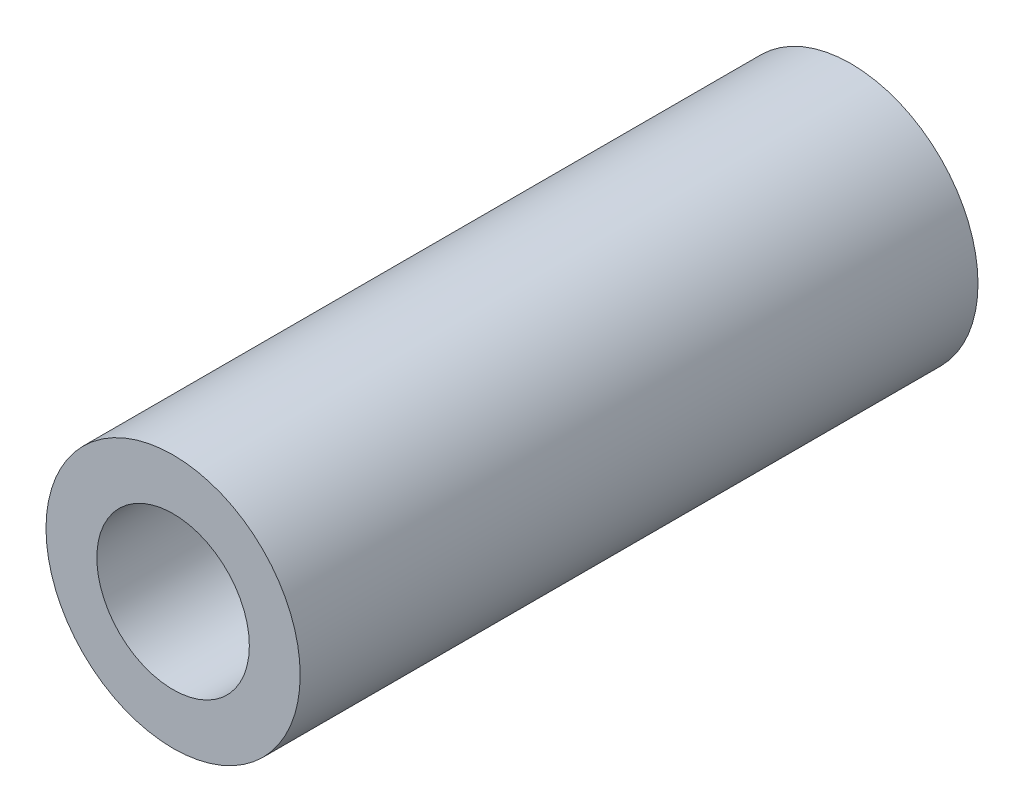
ISO-10303-21;
HEADER;
FILE_DESCRIPTION(('STEP AP214'),'2;1');
FILE_NAME('part.step','',(''),(''),'','','');
FILE_SCHEMA(('AUTOMOTIVE_DESIGN { 1 0 10303 214 1 1 1 1 }'));
ENDSEC;
DATA;
#1=APPLICATION_CONTEXT('core data for automotive mechanical design processes');
#2=APPLICATION_PROTOCOL_DEFINITION('international standard','automotive_design',2000,#1);
#3=PRODUCT_CONTEXT('',#1,'mechanical');
#4=PRODUCT('Part','Part','',(#3));
#5=PRODUCT_RELATED_PRODUCT_CATEGORY('part','',(#4));
#6=PRODUCT_DEFINITION_FORMATION('','',#4);
#7=PRODUCT_DEFINITION_CONTEXT('part definition',#1,'design');
#8=PRODUCT_DEFINITION('design','',#6,#7);
#9=PRODUCT_DEFINITION_SHAPE('','',#8);
#10=(LENGTH_UNIT() NAMED_UNIT(*) SI_UNIT(.MILLI.,.METRE.));
#11=(NAMED_UNIT(*) PLANE_ANGLE_UNIT() SI_UNIT($,.RADIAN.));
#12=(NAMED_UNIT(*) SI_UNIT($,.STERADIAN.) SOLID_ANGLE_UNIT());
#13=UNCERTAINTY_MEASURE_WITH_UNIT(LENGTH_MEASURE(1.E-05),#10,'distance_accuracy_value','');
#14=(GEOMETRIC_REPRESENTATION_CONTEXT(3) GLOBAL_UNCERTAINTY_ASSIGNED_CONTEXT((#13)) GLOBAL_UNIT_ASSIGNED_CONTEXT((#10,
#11,#12)) REPRESENTATION_CONTEXT('',''));
#15=CARTESIAN_POINT('',(0.,0.,0.));
#16=DIRECTION('',(0.,0.,1.));
#17=DIRECTION('',(1.,0.,0.));
#18=AXIS2_PLACEMENT_3D('',#15,#16,#17);
#19=CARTESIAN_POINT('',(0.,0.,20.));
#20=DIRECTION('',(0.,0.,1.));
#21=DIRECTION('',(1.,0.,0.));
#22=AXIS2_PLACEMENT_3D('',#19,#20,#21);
#23=PLANE('',#22);
#24=CARTESIAN_POINT('',(0.,0.,20.));
#25=DIRECTION('',(0.,0.,1.));
#26=DIRECTION('',(1.,0.,0.));
#27=AXIS2_PLACEMENT_3D('',#24,#25,#26);
#28=CIRCLE('',#27,7.5);
#29=CARTESIAN_POINT('',(7.5,0.,20.));
#30=VERTEX_POINT('',#29);
#31=EDGE_CURVE('E10',#30,#30,#28,.T.);
#32=ORIENTED_EDGE('',*,*,#31,.T.);
#33=EDGE_LOOP('',(#32));
#34=FACE_BOUND('',#33,.T.);
#35=CARTESIAN_POINT('',(0.,0.,20.));
#36=DIRECTION('',(0.,0.,1.));
#37=DIRECTION('',(1.,0.,0.));
#38=AXIS2_PLACEMENT_3D('',#35,#36,#37);
#39=CIRCLE('',#38,4.5);
#40=CARTESIAN_POINT('',(4.5,0.,20.));
#41=VERTEX_POINT('',#40);
#42=EDGE_CURVE('E50',#41,#41,#39,.T.);
#43=ORIENTED_EDGE('',*,*,#42,.F.);
#44=EDGE_LOOP('',(#43));
#45=FACE_BOUND('',#44,.T.);
#46=ADVANCED_FACE('F37',(#34,#45),#23,.T.);
#47=CARTESIAN_POINT('',(0.,0.,-20.));
#48=DIRECTION('',(0.,0.,1.));
#49=DIRECTION('',(1.,0.,0.));
#50=AXIS2_PLACEMENT_3D('',#47,#48,#49);
#51=PLANE('',#50);
#52=CARTESIAN_POINT('',(0.,0.,-20.));
#53=DIRECTION('',(0.,0.,1.));
#54=DIRECTION('',(1.,0.,0.));
#55=AXIS2_PLACEMENT_3D('',#52,#53,#54);
#56=CIRCLE('',#55,7.5);
#57=CARTESIAN_POINT('',(7.5,0.,-20.));
#58=VERTEX_POINT('',#57);
#59=EDGE_CURVE('E41',#58,#58,#56,.T.);
#60=ORIENTED_EDGE('',*,*,#59,.F.);
#61=EDGE_LOOP('',(#60));
#62=FACE_BOUND('',#61,.T.);
#63=CARTESIAN_POINT('',(0.,0.,-20.));
#64=DIRECTION('',(0.,0.,1.));
#65=DIRECTION('',(1.,0.,0.));
#66=AXIS2_PLACEMENT_3D('',#63,#64,#65);
#67=CIRCLE('',#66,4.5);
#68=CARTESIAN_POINT('',(4.5,0.,-20.));
#69=VERTEX_POINT('',#68);
#70=EDGE_CURVE('E52',#69,#69,#67,.T.);
#71=ORIENTED_EDGE('',*,*,#70,.T.);
#72=EDGE_LOOP('',(#71));
#73=FACE_BOUND('',#72,.T.);
#74=ADVANCED_FACE('F64',(#62,#73),#51,.F.);
#75=CARTESIAN_POINT('',(0.,0.,20.));
#76=DIRECTION('',(0.,0.,-1.));
#77=DIRECTION('',(-1.,0.,0.));
#78=AXIS2_PLACEMENT_3D('',#75,#76,#77);
#79=CYLINDRICAL_SURFACE('',#78,7.5);
#80=ORIENTED_EDGE('',*,*,#31,.F.);
#81=EDGE_LOOP('',(#80));
#82=FACE_BOUND('',#81,.T.);
#83=ORIENTED_EDGE('',*,*,#59,.T.);
#84=EDGE_LOOP('',(#83));
#85=FACE_BOUND('',#84,.T.);
#86=ADVANCED_FACE('F39',(#82,#85),#79,.T.);
#87=CARTESIAN_POINT('',(0.,0.,20.));
#88=DIRECTION('',(0.,0.,-1.));
#89=DIRECTION('',(-1.,0.,0.));
#90=AXIS2_PLACEMENT_3D('',#87,#88,#89);
#91=CYLINDRICAL_SURFACE('',#90,4.5);
#92=ORIENTED_EDGE('',*,*,#42,.T.);
#93=EDGE_LOOP('',(#92));
#94=FACE_BOUND('',#93,.T.);
#95=ORIENTED_EDGE('',*,*,#70,.F.);
#96=EDGE_LOOP('',(#95));
#97=FACE_BOUND('',#96,.T.);
#98=ADVANCED_FACE('F60',(#94,#97),#91,.F.);
#99=CLOSED_SHELL('',(#46,#74,#86,#98));
#100=MANIFOLD_SOLID_BREP('B2',#99);
#101=ADVANCED_BREP_SHAPE_REPRESENTATION('',(#18,#100),#14);
#102=SHAPE_DEFINITION_REPRESENTATION(#9,#101);
ENDSEC;
END-ISO-10303-21;
